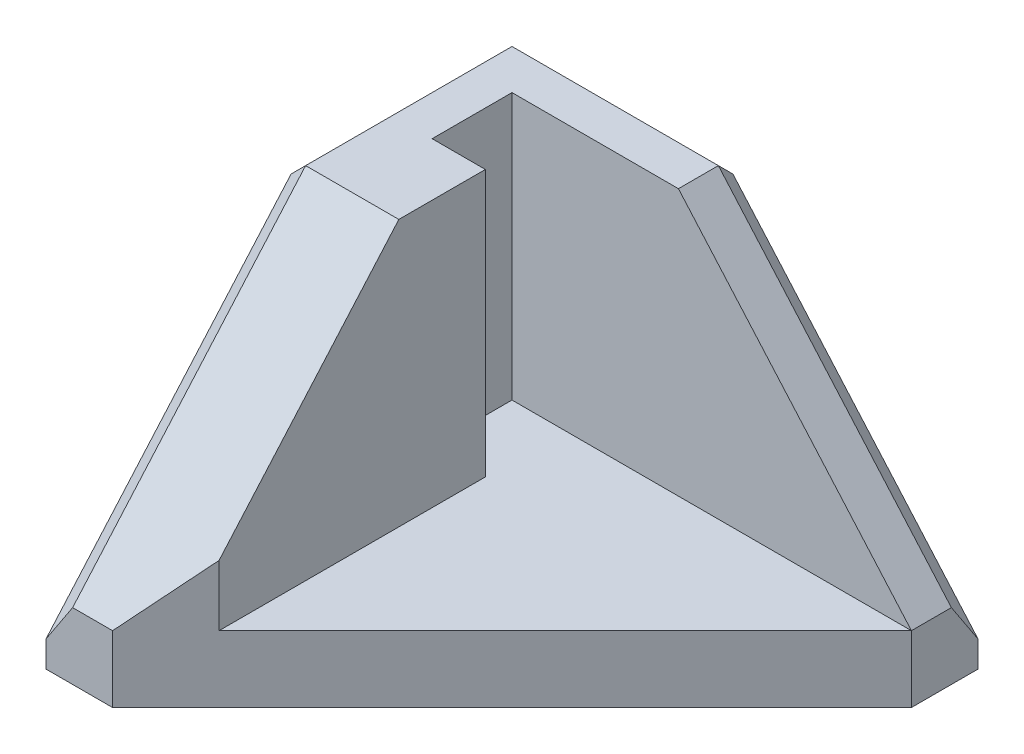
ISO-10303-21;
HEADER;
FILE_DESCRIPTION(('STEP AP214'),'2;1');
FILE_NAME('part.step','',(''),(''),'','','');
FILE_SCHEMA(('AUTOMOTIVE_DESIGN { 1 0 10303 214 1 1 1 1 }'));
ENDSEC;
DATA;
#1=APPLICATION_CONTEXT('core data for automotive mechanical design processes');
#2=APPLICATION_PROTOCOL_DEFINITION('international standard','automotive_design',2000,#1);
#3=PRODUCT_CONTEXT('',#1,'mechanical');
#4=PRODUCT('Part','Part','',(#3));
#5=PRODUCT_RELATED_PRODUCT_CATEGORY('part','',(#4));
#6=PRODUCT_DEFINITION_FORMATION('','',#4);
#7=PRODUCT_DEFINITION_CONTEXT('part definition',#1,'design');
#8=PRODUCT_DEFINITION('design','',#6,#7);
#9=PRODUCT_DEFINITION_SHAPE('','',#8);
#10=(LENGTH_UNIT() NAMED_UNIT(*) SI_UNIT(.MILLI.,.METRE.));
#11=(NAMED_UNIT(*) PLANE_ANGLE_UNIT() SI_UNIT($,.RADIAN.));
#12=(NAMED_UNIT(*) SI_UNIT($,.STERADIAN.) SOLID_ANGLE_UNIT());
#13=UNCERTAINTY_MEASURE_WITH_UNIT(LENGTH_MEASURE(1.E-05),#10,'distance_accuracy_value','');
#14=(GEOMETRIC_REPRESENTATION_CONTEXT(3) GLOBAL_UNCERTAINTY_ASSIGNED_CONTEXT((#13)) GLOBAL_UNIT_ASSIGNED_CONTEXT((#10,
#11,#12)) REPRESENTATION_CONTEXT('',''));
#15=CARTESIAN_POINT('',(0.,0.,0.));
#16=DIRECTION('',(0.,0.,1.));
#17=DIRECTION('',(1.,0.,0.));
#18=AXIS2_PLACEMENT_3D('',#15,#16,#17);
#19=CARTESIAN_POINT('',(0.,5.,0.));
#20=DIRECTION('',(0.,-1.,0.));
#21=DIRECTION('',(0.,0.,-1.));
#22=AXIS2_PLACEMENT_3D('',#19,#20,#21);
#23=PLANE('',#22);
#24=DIRECTION('',(1.,0.,0.));
#25=VECTOR('',#24,1.);
#26=CARTESIAN_POINT('',(17.5,5.,-12.5));
#27=LINE('',#26,#25);
#28=CARTESIAN_POINT('',(-12.5,5.,-12.5));
#29=VERTEX_POINT('',#28);
#30=CARTESIAN_POINT('',(17.5,5.,-12.5));
#31=VERTEX_POINT('',#30);
#32=EDGE_CURVE('E393',#29,#31,#27,.T.);
#33=ORIENTED_EDGE('',*,*,#32,.F.);
#34=DIRECTION('',(0.,0.,-1.));
#35=VECTOR('',#34,1.);
#36=CARTESIAN_POINT('',(-12.5,5.,-6.5));
#37=LINE('',#36,#35);
#38=CARTESIAN_POINT('',(-12.5,5.,-6.5));
#39=VERTEX_POINT('',#38);
#40=EDGE_CURVE('E398',#39,#29,#37,.T.);
#41=ORIENTED_EDGE('',*,*,#40,.F.);
#42=DIRECTION('',(-1.,0.,0.));
#43=VECTOR('',#42,1.);
#44=CARTESIAN_POINT('',(-12.5,5.,-6.5));
#45=LINE('',#44,#43);
#46=CARTESIAN_POINT('',(-8.49999999999999,5.,-6.5));
#47=VERTEX_POINT('',#46);
#48=EDGE_CURVE('E411',#47,#39,#45,.T.);
#49=ORIENTED_EDGE('',*,*,#48,.F.);
#50=DIRECTION('',(0.,0.,-1.));
#51=VECTOR('',#50,1.);
#52=CARTESIAN_POINT('',(-8.49999999999999,5.,-6.5));
#53=LINE('',#52,#51);
#54=CARTESIAN_POINT('',(-8.49999999999999,5.,13.5));
#55=VERTEX_POINT('',#54);
#56=EDGE_CURVE('E409',#55,#47,#53,.T.);
#57=ORIENTED_EDGE('',*,*,#56,.F.);
#58=DIRECTION('',(0.707106781186547,0.,-0.707106781186547));
#59=VECTOR('',#58,1.);
#60=CARTESIAN_POINT('',(17.5,5.,-12.5));
#61=LINE('',#60,#59);
#62=EDGE_CURVE('E161',#55,#31,#61,.T.);
#63=ORIENTED_EDGE('',*,*,#62,.T.);
#64=EDGE_LOOP('',(#33,#41,#49,#57,#63));
#65=FACE_BOUND('',#64,.T.);
#66=ADVANCED_FACE('F33',(#65),#23,.F.);
#67=CARTESIAN_POINT('',(17.5,5.,-12.5));
#68=DIRECTION('',(-1.,0.,0.));
#69=DIRECTION('',(0.,0.,1.));
#70=AXIS2_PLACEMENT_3D('',#67,#68,#69);
#71=PLANE('',#70);
#72=DIRECTION('',(0.,-1.,0.));
#73=VECTOR('',#72,1.);
#74=CARTESIAN_POINT('',(17.5,5.,-17.5));
#75=LINE('',#74,#73);
#76=CARTESIAN_POINT('',(17.5,1.96281548207581,-17.5));
#77=VERTEX_POINT('',#76);
#78=CARTESIAN_POINT('',(17.5,0.,-17.5));
#79=VERTEX_POINT('',#78);
#80=EDGE_CURVE('E166',#77,#79,#75,.T.);
#81=ORIENTED_EDGE('',*,*,#80,.F.);
#82=DIRECTION('',(0.,-0.835183132131828,-0.549971940922871));
#83=VECTOR('',#82,1.);
#84=CARTESIAN_POINT('',(17.5,5.,-15.5));
#85=LINE('',#84,#83);
#86=CARTESIAN_POINT('',(17.5,5.,-15.5));
#87=VERTEX_POINT('',#86);
#88=EDGE_CURVE('E180',#77,#87,#85,.F.);
#89=ORIENTED_EDGE('',*,*,#88,.T.);
#90=DIRECTION('',(0.,0.,-1.));
#91=VECTOR('',#90,1.);
#92=CARTESIAN_POINT('',(17.5,5.,2.5));
#93=LINE('',#92,#91);
#94=EDGE_CURVE('E149',#31,#87,#93,.T.);
#95=ORIENTED_EDGE('',*,*,#94,.F.);
#96=DIRECTION('',(0.,-1.,0.));
#97=VECTOR('',#96,1.);
#98=CARTESIAN_POINT('',(17.5,5.,-12.5));
#99=LINE('',#98,#97);
#100=CARTESIAN_POINT('',(17.5,0.,-12.5));
#101=VERTEX_POINT('',#100);
#102=EDGE_CURVE('E156',#31,#101,#99,.T.);
#103=ORIENTED_EDGE('',*,*,#102,.T.);
#104=DIRECTION('',(0.,0.,-1.));
#105=VECTOR('',#104,1.);
#106=CARTESIAN_POINT('',(17.5,0.,-12.5));
#107=LINE('',#106,#105);
#108=EDGE_CURVE('E423',#101,#79,#107,.T.);
#109=ORIENTED_EDGE('',*,*,#108,.T.);
#110=EDGE_LOOP('',(#81,#89,#95,#103,#109));
#111=FACE_BOUND('',#110,.T.);
#112=ADVANCED_FACE('F211',(#111),#71,.F.);
#113=CARTESIAN_POINT('',(-17.5,5.,-17.5));
#114=DIRECTION('',(0.,0.,1.));
#115=DIRECTION('',(1.,0.,0.));
#116=AXIS2_PLACEMENT_3D('',#113,#114,#115);
#117=PLANE('',#116);
#118=DIRECTION('',(1.,0.,0.));
#119=VECTOR('',#118,1.);
#120=CARTESIAN_POINT('',(-17.5,23.,-17.5));
#121=LINE('',#120,#119);
#122=CARTESIAN_POINT('',(-17.5,23.,-17.5));
#123=VERTEX_POINT('',#122);
#124=CARTESIAN_POINT('',(-0.90753645318366,23.,-17.5));
#125=VERTEX_POINT('',#124);
#126=EDGE_CURVE('E176',#123,#125,#121,.T.);
#127=ORIENTED_EDGE('',*,*,#126,.T.);
#128=DIRECTION('',(0.658504607868518,-0.752576694706878,0.));
#129=VECTOR('',#128,1.);
#130=CARTESIAN_POINT('',(0.817855460143763,21.0281235276258,-17.5));
#131=LINE('',#130,#129);
#132=EDGE_CURVE('E178',#125,#77,#131,.T.);
#133=ORIENTED_EDGE('',*,*,#132,.T.);
#134=ORIENTED_EDGE('',*,*,#80,.T.);
#135=DIRECTION('',(-1.,0.,0.));
#136=VECTOR('',#135,1.);
#137=CARTESIAN_POINT('',(-17.5,0.,-17.5));
#138=LINE('',#137,#136);
#139=CARTESIAN_POINT('',(-17.5,0.,-17.5));
#140=VERTEX_POINT('',#139);
#141=EDGE_CURVE('E429',#79,#140,#138,.T.);
#142=ORIENTED_EDGE('',*,*,#141,.T.);
#143=DIRECTION('',(0.,-1.,0.));
#144=VECTOR('',#143,1.);
#145=CARTESIAN_POINT('',(-17.5,5.,-17.5));
#146=LINE('',#145,#144);
#147=EDGE_CURVE('E158',#123,#140,#146,.T.);
#148=ORIENTED_EDGE('',*,*,#147,.F.);
#149=EDGE_LOOP('',(#127,#133,#134,#142,#148));
#150=FACE_BOUND('',#149,.T.);
#151=ADVANCED_FACE('F217',(#150),#117,.F.);
#152=CARTESIAN_POINT('',(-17.5,5.,17.5));
#153=DIRECTION('',(1.,0.,0.));
#154=DIRECTION('',(0.,0.,-1.));
#155=AXIS2_PLACEMENT_3D('',#152,#153,#154);
#156=PLANE('',#155);
#157=DIRECTION('',(0.,-1.,0.));
#158=VECTOR('',#157,1.);
#159=CARTESIAN_POINT('',(-17.5,5.,17.5));
#160=LINE('',#159,#158);
#161=CARTESIAN_POINT('',(-17.5,1.9628154820758,17.5));
#162=VERTEX_POINT('',#161);
#163=CARTESIAN_POINT('',(-17.5,0.,17.5));
#164=VERTEX_POINT('',#163);
#165=EDGE_CURVE('E155',#162,#164,#160,.T.);
#166=ORIENTED_EDGE('',*,*,#165,.F.);
#167=DIRECTION('',(0.,0.752576694706878,-0.658504607868518));
#168=VECTOR('',#167,1.);
#169=CARTESIAN_POINT('',(-17.5,3.68299078426296,15.9948466105862));
#170=LINE('',#169,#168);
#171=CARTESIAN_POINT('',(-17.5,23.,-0.907536453183666));
#172=VERTEX_POINT('',#171);
#173=EDGE_CURVE('E11',#162,#172,#170,.T.);
#174=ORIENTED_EDGE('',*,*,#173,.T.);
#175=DIRECTION('',(0.,0.,-1.));
#176=VECTOR('',#175,1.);
#177=CARTESIAN_POINT('',(-17.5,23.,17.5));
#178=LINE('',#177,#176);
#179=EDGE_CURVE('E42',#172,#123,#178,.T.);
#180=ORIENTED_EDGE('',*,*,#179,.T.);
#181=ORIENTED_EDGE('',*,*,#147,.T.);
#182=DIRECTION('',(0.,0.,1.));
#183=VECTOR('',#182,1.);
#184=CARTESIAN_POINT('',(-17.5,0.,17.5));
#185=LINE('',#184,#183);
#186=EDGE_CURVE('E432',#140,#164,#185,.T.);
#187=ORIENTED_EDGE('',*,*,#186,.T.);
#188=EDGE_LOOP('',(#166,#174,#180,#181,#187));
#189=FACE_BOUND('',#188,.T.);
#190=ADVANCED_FACE('F232',(#189),#156,.F.);
#191=CARTESIAN_POINT('',(-17.5,5.,17.5));
#192=DIRECTION('',(0.,0.,-1.));
#193=DIRECTION('',(-1.,0.,0.));
#194=AXIS2_PLACEMENT_3D('',#191,#192,#193);
#195=PLANE('',#194);
#196=DIRECTION('',(-1.,0.,0.));
#197=VECTOR('',#196,1.);
#198=CARTESIAN_POINT('',(2.5,5.,17.5));
#199=LINE('',#198,#197);
#200=CARTESIAN_POINT('',(-12.5,5.,17.5));
#201=VERTEX_POINT('',#200);
#202=CARTESIAN_POINT('',(-15.5,5.,17.5));
#203=VERTEX_POINT('',#202);
#204=EDGE_CURVE('E130',#201,#203,#199,.T.);
#205=ORIENTED_EDGE('',*,*,#204,.T.);
#206=DIRECTION('',(0.54997194092287,0.835183132131828,0.));
#207=VECTOR('',#206,1.);
#208=CARTESIAN_POINT('',(-15.5,5.,17.5));
#209=LINE('',#208,#207);
#210=EDGE_CURVE('E56',#203,#162,#209,.F.);
#211=ORIENTED_EDGE('',*,*,#210,.T.);
#212=ORIENTED_EDGE('',*,*,#165,.T.);
#213=DIRECTION('',(1.,0.,0.));
#214=VECTOR('',#213,1.);
#215=CARTESIAN_POINT('',(-17.5,0.,17.5));
#216=LINE('',#215,#214);
#217=CARTESIAN_POINT('',(-12.5,0.,17.5));
#218=VERTEX_POINT('',#217);
#219=EDGE_CURVE('E153',#164,#218,#216,.T.);
#220=ORIENTED_EDGE('',*,*,#219,.T.);
#221=DIRECTION('',(0.,-1.,0.));
#222=VECTOR('',#221,1.);
#223=CARTESIAN_POINT('',(-12.5,5.,17.5));
#224=LINE('',#223,#222);
#225=EDGE_CURVE('E145',#201,#218,#224,.T.);
#226=ORIENTED_EDGE('',*,*,#225,.F.);
#227=EDGE_LOOP('',(#205,#211,#212,#220,#226));
#228=FACE_BOUND('',#227,.T.);
#229=ADVANCED_FACE('F151',(#228),#195,.F.);
#230=CARTESIAN_POINT('',(17.5,5.,-12.5));
#231=DIRECTION('',(-0.707106781186548,0.,-0.707106781186547));
#232=DIRECTION('',(-0.707106781186547,0.,0.707106781186548));
#233=AXIS2_PLACEMENT_3D('',#230,#231,#232);
#234=PLANE('',#233);
#235=DIRECTION('',(0.,-1.,0.));
#236=VECTOR('',#235,1.);
#237=CARTESIAN_POINT('',(-8.49999999999999,25.,13.5));
#238=LINE('',#237,#236);
#239=CARTESIAN_POINT('',(-8.49999999999999,9.57142857142859,13.5));
#240=VERTEX_POINT('',#239);
#241=EDGE_CURVE('E148',#240,#55,#238,.T.);
#242=ORIENTED_EDGE('',*,*,#241,.F.);
#243=DIRECTION('',(-0.54997194092287,-0.628539361054709,0.54997194092287));
#244=VECTOR('',#243,1.);
#245=CARTESIAN_POINT('',(5.64814814814815,25.7407407407407,-0.648148148148146));
#246=LINE('',#245,#244);
#247=EDGE_CURVE('E135',#240,#201,#246,.T.);
#248=ORIENTED_EDGE('',*,*,#247,.T.);
#249=ORIENTED_EDGE('',*,*,#225,.T.);
#250=DIRECTION('',(0.707106781186547,0.,-0.707106781186547));
#251=VECTOR('',#250,1.);
#252=CARTESIAN_POINT('',(17.5,0.,-12.5));
#253=LINE('',#252,#251);
#254=EDGE_CURVE('E426',#218,#101,#253,.T.);
#255=ORIENTED_EDGE('',*,*,#254,.T.);
#256=ORIENTED_EDGE('',*,*,#102,.F.);
#257=ORIENTED_EDGE('',*,*,#62,.F.);
#258=EDGE_LOOP('',(#242,#248,#249,#255,#256,#257));
#259=FACE_BOUND('',#258,.T.);
#260=ADVANCED_FACE('F144',(#259),#234,.F.);
#261=CARTESIAN_POINT('',(0.,0.,0.));
#262=DIRECTION('',(0.,-1.,0.));
#263=DIRECTION('',(0.,0.,-1.));
#264=AXIS2_PLACEMENT_3D('',#261,#262,#263);
#265=PLANE('',#264);
#266=ORIENTED_EDGE('',*,*,#108,.F.);
#267=ORIENTED_EDGE('',*,*,#254,.F.);
#268=ORIENTED_EDGE('',*,*,#219,.F.);
#269=ORIENTED_EDGE('',*,*,#186,.F.);
#270=ORIENTED_EDGE('',*,*,#141,.F.);
#271=EDGE_LOOP('',(#266,#267,#268,#269,#270));
#272=FACE_BOUND('',#271,.T.);
#273=ADVANCED_FACE('F224',(#272),#265,.T.);
#274=CARTESIAN_POINT('',(-8.49999999999999,25.,-6.5));
#275=DIRECTION('',(-1.,0.,0.));
#276=DIRECTION('',(0.,0.,1.));
#277=AXIS2_PLACEMENT_3D('',#274,#275,#276);
#278=PLANE('',#277);
#279=DIRECTION('',(0.,0.,-1.));
#280=VECTOR('',#279,1.);
#281=CARTESIAN_POINT('',(-8.49999999999999,25.,-6.5));
#282=LINE('',#281,#280);
#283=CARTESIAN_POINT('',(-8.49999999999999,25.,0.));
#284=VERTEX_POINT('',#283);
#285=CARTESIAN_POINT('',(-8.49999999999999,25.,-6.5));
#286=VERTEX_POINT('',#285);
#287=EDGE_CURVE('E387',#284,#286,#282,.T.);
#288=ORIENTED_EDGE('',*,*,#287,.F.);
#289=DIRECTION('',(0.,-0.752576694706878,0.658504607868518));
#290=VECTOR('',#289,1.);
#291=CARTESIAN_POINT('',(-8.49999999999999,28.2212389380531,-2.81858407079646));
#292=LINE('',#291,#290);
#293=EDGE_CURVE('E140',#284,#240,#292,.T.);
#294=ORIENTED_EDGE('',*,*,#293,.T.);
#295=ORIENTED_EDGE('',*,*,#241,.T.);
#296=ORIENTED_EDGE('',*,*,#56,.T.);
#297=DIRECTION('',(0.,-1.,0.));
#298=VECTOR('',#297,1.);
#299=CARTESIAN_POINT('',(-8.49999999999999,25.,-6.5));
#300=LINE('',#299,#298);
#301=EDGE_CURVE('E390',#286,#47,#300,.T.);
#302=ORIENTED_EDGE('',*,*,#301,.F.);
#303=EDGE_LOOP('',(#288,#294,#295,#296,#302));
#304=FACE_BOUND('',#303,.T.);
#305=ADVANCED_FACE('F222',(#304),#278,.F.);
#306=CARTESIAN_POINT('',(-12.5,25.,-6.5));
#307=DIRECTION('',(0.,0.,1.));
#308=DIRECTION('',(1.,0.,0.));
#309=AXIS2_PLACEMENT_3D('',#306,#307,#308);
#310=PLANE('',#309);
#311=ORIENTED_EDGE('',*,*,#48,.T.);
#312=DIRECTION('',(0.,-1.,0.));
#313=VECTOR('',#312,1.);
#314=CARTESIAN_POINT('',(-12.5,25.,-6.5));
#315=LINE('',#314,#313);
#316=CARTESIAN_POINT('',(-12.5,25.,-6.5));
#317=VERTEX_POINT('',#316);
#318=EDGE_CURVE('E418',#317,#39,#315,.T.);
#319=ORIENTED_EDGE('',*,*,#318,.F.);
#320=DIRECTION('',(-1.,0.,0.));
#321=VECTOR('',#320,1.);
#322=CARTESIAN_POINT('',(-12.5,25.,-6.5));
#323=LINE('',#322,#321);
#324=EDGE_CURVE('E392',#286,#317,#323,.T.);
#325=ORIENTED_EDGE('',*,*,#324,.F.);
#326=ORIENTED_EDGE('',*,*,#301,.T.);
#327=EDGE_LOOP('',(#311,#319,#325,#326));
#328=FACE_BOUND('',#327,.T.);
#329=ADVANCED_FACE('F305',(#328),#310,.F.);
#330=CARTESIAN_POINT('',(-12.5,25.,-6.5));
#331=DIRECTION('',(-1.,0.,0.));
#332=DIRECTION('',(0.,0.,1.));
#333=AXIS2_PLACEMENT_3D('',#330,#331,#332);
#334=PLANE('',#333);
#335=ORIENTED_EDGE('',*,*,#40,.T.);
#336=DIRECTION('',(0.,-1.,0.));
#337=VECTOR('',#336,1.);
#338=CARTESIAN_POINT('',(-12.5,25.,-12.5));
#339=LINE('',#338,#337);
#340=CARTESIAN_POINT('',(-12.5,25.,-12.5));
#341=VERTEX_POINT('',#340);
#342=EDGE_CURVE('E408',#341,#29,#339,.T.);
#343=ORIENTED_EDGE('',*,*,#342,.F.);
#344=DIRECTION('',(0.,0.,-1.));
#345=VECTOR('',#344,1.);
#346=CARTESIAN_POINT('',(-12.5,25.,-6.5));
#347=LINE('',#346,#345);
#348=EDGE_CURVE('E395',#317,#341,#347,.T.);
#349=ORIENTED_EDGE('',*,*,#348,.F.);
#350=ORIENTED_EDGE('',*,*,#318,.T.);
#351=EDGE_LOOP('',(#335,#343,#349,#350));
#352=FACE_BOUND('',#351,.T.);
#353=ADVANCED_FACE('F295',(#352),#334,.F.);
#354=CARTESIAN_POINT('',(17.5,25.,-12.5));
#355=DIRECTION('',(0.,0.,-1.));
#356=DIRECTION('',(-1.,0.,0.));
#357=AXIS2_PLACEMENT_3D('',#354,#355,#356);
#358=PLANE('',#357);
#359=ORIENTED_EDGE('',*,*,#32,.T.);
#360=DIRECTION('',(-0.658504607868518,0.752576694706878,0.));
#361=VECTOR('',#360,1.);
#362=CARTESIAN_POINT('',(7.58849557522124,16.3274336283186,-12.5));
#363=LINE('',#362,#361);
#364=CARTESIAN_POINT('',(0.,25.,-12.5));
#365=VERTEX_POINT('',#364);
#366=EDGE_CURVE('E401',#31,#365,#363,.T.);
#367=ORIENTED_EDGE('',*,*,#366,.T.);
#368=DIRECTION('',(1.,0.,0.));
#369=VECTOR('',#368,1.);
#370=CARTESIAN_POINT('',(17.5,25.,-12.5));
#371=LINE('',#370,#369);
#372=EDGE_CURVE('E405',#341,#365,#371,.T.);
#373=ORIENTED_EDGE('',*,*,#372,.F.);
#374=ORIENTED_EDGE('',*,*,#342,.T.);
#375=EDGE_LOOP('',(#359,#367,#373,#374));
#376=FACE_BOUND('',#375,.T.);
#377=ADVANCED_FACE('F285',(#376),#358,.F.);
#378=CARTESIAN_POINT('',(0.,25.,0.));
#379=DIRECTION('',(0.,-1.,0.));
#380=DIRECTION('',(0.,0.,-1.));
#381=AXIS2_PLACEMENT_3D('',#378,#379,#380);
#382=PLANE('',#381);
#383=DIRECTION('',(0.,0.,-1.));
#384=VECTOR('',#383,1.);
#385=CARTESIAN_POINT('',(0.,25.,0.));
#386=LINE('',#385,#384);
#387=CARTESIAN_POINT('',(0.,25.,-15.5));
#388=VERTEX_POINT('',#387);
#389=EDGE_CURVE('E168',#365,#388,#386,.T.);
#390=ORIENTED_EDGE('',*,*,#389,.T.);
#391=DIRECTION('',(-1.,0.,0.));
#392=VECTOR('',#391,1.);
#393=CARTESIAN_POINT('',(0.,25.,-15.5));
#394=LINE('',#393,#392);
#395=CARTESIAN_POINT('',(-15.5,25.,-15.5));
#396=VERTEX_POINT('',#395);
#397=EDGE_CURVE('E184',#388,#396,#394,.T.);
#398=ORIENTED_EDGE('',*,*,#397,.T.);
#399=DIRECTION('',(0.,0.,1.));
#400=VECTOR('',#399,1.);
#401=CARTESIAN_POINT('',(-15.5,25.,0.));
#402=LINE('',#401,#400);
#403=CARTESIAN_POINT('',(-15.5,25.,0.));
#404=VERTEX_POINT('',#403);
#405=EDGE_CURVE('E182',#396,#404,#402,.T.);
#406=ORIENTED_EDGE('',*,*,#405,.T.);
#407=DIRECTION('',(1.,0.,0.));
#408=VECTOR('',#407,1.);
#409=CARTESIAN_POINT('',(0.,25.,0.));
#410=LINE('',#409,#408);
#411=EDGE_CURVE('E171',#404,#284,#410,.T.);
#412=ORIENTED_EDGE('',*,*,#411,.T.);
#413=ORIENTED_EDGE('',*,*,#287,.T.);
#414=ORIENTED_EDGE('',*,*,#324,.T.);
#415=ORIENTED_EDGE('',*,*,#348,.T.);
#416=ORIENTED_EDGE('',*,*,#372,.T.);
#417=EDGE_LOOP('',(#390,#398,#406,#412,#413,#414,#415,#416));
#418=FACE_BOUND('',#417,.T.);
#419=ADVANCED_FACE('F276',(#418),#382,.F.);
#420=CARTESIAN_POINT('',(17.5,5.,2.5));
#421=DIRECTION('',(-0.752576694706878,-0.658504607868518,0.));
#422=DIRECTION('',(0.658504607868518,-0.752576694706878,0.));
#423=AXIS2_PLACEMENT_3D('',#420,#421,#422);
#424=PLANE('',#423);
#425=ORIENTED_EDGE('',*,*,#94,.T.);
#426=DIRECTION('',(-0.658504607868518,0.752576694706878,0.));
#427=VECTOR('',#426,1.);
#428=CARTESIAN_POINT('',(17.5,5.,-15.5));
#429=LINE('',#428,#427);
#430=EDGE_CURVE('E173',#87,#388,#429,.T.);
#431=ORIENTED_EDGE('',*,*,#430,.T.);
#432=ORIENTED_EDGE('',*,*,#389,.F.);
#433=ORIENTED_EDGE('',*,*,#366,.F.);
#434=EDGE_LOOP('',(#425,#431,#432,#433));
#435=FACE_BOUND('',#434,.T.);
#436=ADVANCED_FACE('F208',(#435),#424,.F.);
#437=CARTESIAN_POINT('',(2.5,5.,17.5));
#438=DIRECTION('',(0.,-0.658504607868518,-0.752576694706878));
#439=DIRECTION('',(0.,0.752576694706878,-0.658504607868518));
#440=AXIS2_PLACEMENT_3D('',#437,#438,#439);
#441=PLANE('',#440);
#442=ORIENTED_EDGE('',*,*,#411,.F.);
#443=DIRECTION('',(0.,-0.752576694706878,0.658504607868518));
#444=VECTOR('',#443,1.);
#445=CARTESIAN_POINT('',(-15.5,5.,17.5));
#446=LINE('',#445,#444);
#447=EDGE_CURVE('E138',#404,#203,#446,.T.);
#448=ORIENTED_EDGE('',*,*,#447,.T.);
#449=ORIENTED_EDGE('',*,*,#204,.F.);
#450=ORIENTED_EDGE('',*,*,#247,.F.);
#451=ORIENTED_EDGE('',*,*,#293,.F.);
#452=EDGE_LOOP('',(#442,#448,#449,#450,#451));
#453=FACE_BOUND('',#452,.T.);
#454=ADVANCED_FACE('F133',(#453),#441,.F.);
#455=CARTESIAN_POINT('',(-15.5,5.,17.5));
#456=DIRECTION('',(0.707106781186548,-0.465633073666417,-0.532152084190191));
#457=DIRECTION('',(0.,-0.752576694706878,0.658504607868518));
#458=AXIS2_PLACEMENT_3D('',#455,#456,#457);
#459=PLANE('',#458);
#460=ORIENTED_EDGE('',*,*,#210,.F.);
#461=ORIENTED_EDGE('',*,*,#447,.F.);
#462=DIRECTION('',(0.673296780879618,0.673296780879618,0.305520686229734));
#463=VECTOR('',#462,1.);
#464=CARTESIAN_POINT('',(-15.5,25.,0.));
#465=LINE('',#464,#463);
#466=EDGE_CURVE('E37',#172,#404,#465,.T.);
#467=ORIENTED_EDGE('',*,*,#466,.F.);
#468=ORIENTED_EDGE('',*,*,#173,.F.);
#469=EDGE_LOOP('',(#460,#461,#467,#468));
#470=FACE_BOUND('',#469,.T.);
#471=ADVANCED_FACE('F35',(#470),#459,.F.);
#472=CARTESIAN_POINT('',(-15.5,25.,0.));
#473=DIRECTION('',(0.707106781186548,-0.707106781186548,0.));
#474=DIRECTION('',(0.,0.,1.));
#475=AXIS2_PLACEMENT_3D('',#472,#473,#474);
#476=PLANE('',#475);
#477=ORIENTED_EDGE('',*,*,#466,.T.);
#478=ORIENTED_EDGE('',*,*,#405,.F.);
#479=DIRECTION('',(-0.577350269189626,-0.577350269189626,-0.577350269189626));
#480=VECTOR('',#479,1.);
#481=CARTESIAN_POINT('',(-10.3333333333333,30.1666666666667,-10.3333333333333));
#482=LINE('',#481,#480);
#483=EDGE_CURVE('E190',#123,#396,#482,.F.);
#484=ORIENTED_EDGE('',*,*,#483,.F.);
#485=ORIENTED_EDGE('',*,*,#179,.F.);
#486=EDGE_LOOP('',(#477,#478,#484,#485));
#487=FACE_BOUND('',#486,.T.);
#488=ADVANCED_FACE('F200',(#487),#476,.F.);
#489=CARTESIAN_POINT('',(0.,25.,-15.5));
#490=DIRECTION('',(0.,-0.707106781186548,0.707106781186548));
#491=DIRECTION('',(-1.,0.,0.));
#492=AXIS2_PLACEMENT_3D('',#489,#490,#491);
#493=PLANE('',#492);
#494=ORIENTED_EDGE('',*,*,#483,.T.);
#495=ORIENTED_EDGE('',*,*,#397,.F.);
#496=DIRECTION('',(-0.305520686229732,-0.673296780879618,-0.673296780879618));
#497=VECTOR('',#496,1.);
#498=CARTESIAN_POINT('',(0.,25.,-15.5));
#499=LINE('',#498,#497);
#500=EDGE_CURVE('E189',#125,#388,#499,.F.);
#501=ORIENTED_EDGE('',*,*,#500,.F.);
#502=ORIENTED_EDGE('',*,*,#126,.F.);
#503=EDGE_LOOP('',(#494,#495,#501,#502));
#504=FACE_BOUND('',#503,.T.);
#505=ADVANCED_FACE('F207',(#504),#493,.F.);
#506=CARTESIAN_POINT('',(17.5,5.,-15.5));
#507=DIRECTION('',(-0.532152084190192,-0.465633073666418,0.707106781186547));
#508=DIRECTION('',(-0.658504607868518,0.752576694706878,0.));
#509=AXIS2_PLACEMENT_3D('',#506,#507,#508);
#510=PLANE('',#509);
#511=ORIENTED_EDGE('',*,*,#88,.F.);
#512=ORIENTED_EDGE('',*,*,#132,.F.);
#513=ORIENTED_EDGE('',*,*,#500,.T.);
#514=ORIENTED_EDGE('',*,*,#430,.F.);
#515=EDGE_LOOP('',(#511,#512,#513,#514));
#516=FACE_BOUND('',#515,.T.);
#517=ADVANCED_FACE('F238',(#516),#510,.F.);
#518=CLOSED_SHELL('',(#66,#112,#151,#190,#229,#260,#273,#305,#329,#353,#377,#419,#436,#454,#471,
#488,#505,#517));
#519=MANIFOLD_SOLID_BREP('B2',#518);
#520=ADVANCED_BREP_SHAPE_REPRESENTATION('',(#18,#519),#14);
#521=SHAPE_DEFINITION_REPRESENTATION(#9,#520);
ENDSEC;
END-ISO-10303-21;
